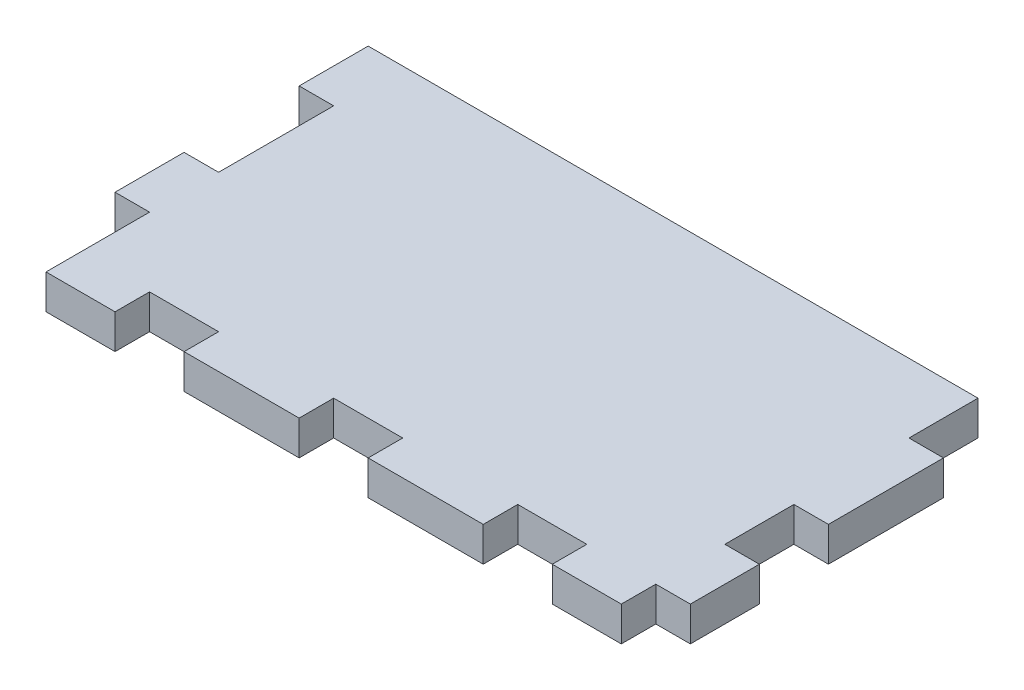
ISO-10303-21;
HEADER;
FILE_DESCRIPTION(('STEP AP214'),'2;1');
FILE_NAME('part.step','',(''),(''),'','','');
FILE_SCHEMA(('AUTOMOTIVE_DESIGN { 1 0 10303 214 1 1 1 1 }'));
ENDSEC;
DATA;
#1=APPLICATION_CONTEXT('core data for automotive mechanical design processes');
#2=APPLICATION_PROTOCOL_DEFINITION('international standard','automotive_design',2000,#1);
#3=PRODUCT_CONTEXT('',#1,'mechanical');
#4=PRODUCT('Part','Part','',(#3));
#5=PRODUCT_RELATED_PRODUCT_CATEGORY('part','',(#4));
#6=PRODUCT_DEFINITION_FORMATION('','',#4);
#7=PRODUCT_DEFINITION_CONTEXT('part definition',#1,'design');
#8=PRODUCT_DEFINITION('design','',#6,#7);
#9=PRODUCT_DEFINITION_SHAPE('','',#8);
#10=(LENGTH_UNIT() NAMED_UNIT(*) SI_UNIT(.MILLI.,.METRE.));
#11=(NAMED_UNIT(*) PLANE_ANGLE_UNIT() SI_UNIT($,.RADIAN.));
#12=(NAMED_UNIT(*) SI_UNIT($,.STERADIAN.) SOLID_ANGLE_UNIT());
#13=UNCERTAINTY_MEASURE_WITH_UNIT(LENGTH_MEASURE(1.E-05),#10,'distance_accuracy_value','');
#14=(GEOMETRIC_REPRESENTATION_CONTEXT(3) GLOBAL_UNCERTAINTY_ASSIGNED_CONTEXT((#13)) GLOBAL_UNIT_ASSIGNED_CONTEXT((#10,
#11,#12)) REPRESENTATION_CONTEXT('',''));
#15=CARTESIAN_POINT('',(0.,0.,0.));
#16=DIRECTION('',(0.,0.,1.));
#17=DIRECTION('',(1.,0.,0.));
#18=AXIS2_PLACEMENT_3D('',#15,#16,#17);
#19=CARTESIAN_POINT('',(-53.,3.,0.));
#20=DIRECTION('',(1.,0.,0.));
#21=DIRECTION('',(0.,0.,-1.));
#22=AXIS2_PLACEMENT_3D('',#19,#20,#21);
#23=PLANE('',#22);
#24=DIRECTION('',(0.,0.,1.));
#25=VECTOR('',#24,1.);
#26=CARTESIAN_POINT('',(-53.,0.,0.));
#27=LINE('',#26,#25);
#28=CARTESIAN_POINT('',(-53.,0.,-12.));
#29=VERTEX_POINT('',#28);
#30=CARTESIAN_POINT('',(-53.,0.,-5.99999999999999));
#31=VERTEX_POINT('',#30);
#32=EDGE_CURVE('E891',#29,#31,#27,.T.);
#33=ORIENTED_EDGE('',*,*,#32,.T.);
#34=DIRECTION('',(0.,-1.,0.));
#35=VECTOR('',#34,1.);
#36=CARTESIAN_POINT('',(-53.,3.,-5.99999999999999));
#37=LINE('',#36,#35);
#38=CARTESIAN_POINT('',(-53.,3.,-5.99999999999999));
#39=VERTEX_POINT('',#38);
#40=EDGE_CURVE('E995',#39,#31,#37,.T.);
#41=ORIENTED_EDGE('',*,*,#40,.F.);
#42=DIRECTION('',(0.,0.,1.));
#43=VECTOR('',#42,1.);
#44=CARTESIAN_POINT('',(-53.,3.,0.));
#45=LINE('',#44,#43);
#46=CARTESIAN_POINT('',(-53.,3.,-12.));
#47=VERTEX_POINT('',#46);
#48=EDGE_CURVE('E1383',#47,#39,#45,.T.);
#49=ORIENTED_EDGE('',*,*,#48,.F.);
#50=DIRECTION('',(0.,-1.,0.));
#51=VECTOR('',#50,1.);
#52=CARTESIAN_POINT('',(-53.,3.,-12.));
#53=LINE('',#52,#51);
#54=EDGE_CURVE('E997',#47,#29,#53,.T.);
#55=ORIENTED_EDGE('',*,*,#54,.T.);
#56=EDGE_LOOP('',(#33,#41,#49,#55));
#57=FACE_BOUND('',#56,.T.);
#58=ADVANCED_FACE('F611',(#57),#23,.F.);
#59=CARTESIAN_POINT('',(0.,3.,-6.00000000000001));
#60=DIRECTION('',(0.,0.,1.));
#61=DIRECTION('',(1.,0.,0.));
#62=AXIS2_PLACEMENT_3D('',#59,#60,#61);
#63=PLANE('',#62);
#64=DIRECTION('',(-1.,0.,0.));
#65=VECTOR('',#64,1.);
#66=CARTESIAN_POINT('',(0.,0.,-6.00000000000001));
#67=LINE('',#66,#65);
#68=CARTESIAN_POINT('',(-50.,0.,-5.99999999999999));
#69=VERTEX_POINT('',#68);
#70=EDGE_CURVE('E895',#69,#31,#67,.T.);
#71=ORIENTED_EDGE('',*,*,#70,.F.);
#72=DIRECTION('',(0.,-1.,0.));
#73=VECTOR('',#72,1.);
#74=CARTESIAN_POINT('',(-50.,3.,-5.99999999999999));
#75=LINE('',#74,#73);
#76=CARTESIAN_POINT('',(-50.,3.,-5.99999999999999));
#77=VERTEX_POINT('',#76);
#78=EDGE_CURVE('E993',#77,#69,#75,.T.);
#79=ORIENTED_EDGE('',*,*,#78,.F.);
#80=DIRECTION('',(-1.,0.,0.));
#81=VECTOR('',#80,1.);
#82=CARTESIAN_POINT('',(0.,3.,-6.00000000000001));
#83=LINE('',#82,#81);
#84=EDGE_CURVE('E1391',#77,#39,#83,.T.);
#85=ORIENTED_EDGE('',*,*,#84,.T.);
#86=ORIENTED_EDGE('',*,*,#40,.T.);
#87=EDGE_LOOP('',(#71,#79,#85,#86));
#88=FACE_BOUND('',#87,.T.);
#89=ADVANCED_FACE('F1048',(#88),#63,.T.);
#90=CARTESIAN_POINT('',(-50.,3.,0.));
#91=DIRECTION('',(-1.,0.,0.));
#92=DIRECTION('',(0.,0.,1.));
#93=AXIS2_PLACEMENT_3D('',#90,#91,#92);
#94=PLANE('',#93);
#95=DIRECTION('',(0.,0.,-1.));
#96=VECTOR('',#95,1.);
#97=CARTESIAN_POINT('',(-50.,0.,0.));
#98=LINE('',#97,#96);
#99=CARTESIAN_POINT('',(-50.,0.,3.00000000000001));
#100=VERTEX_POINT('',#99);
#101=EDGE_CURVE('E898',#100,#69,#98,.T.);
#102=ORIENTED_EDGE('',*,*,#101,.F.);
#103=DIRECTION('',(0.,-1.,0.));
#104=VECTOR('',#103,1.);
#105=CARTESIAN_POINT('',(-50.,3.,3.00000000000001));
#106=LINE('',#105,#104);
#107=CARTESIAN_POINT('',(-50.,3.,3.00000000000001));
#108=VERTEX_POINT('',#107);
#109=EDGE_CURVE('E1008',#108,#100,#106,.T.);
#110=ORIENTED_EDGE('',*,*,#109,.F.);
#111=DIRECTION('',(0.,0.,-1.));
#112=VECTOR('',#111,1.);
#113=CARTESIAN_POINT('',(-50.,3.,0.));
#114=LINE('',#113,#112);
#115=EDGE_CURVE('E843',#108,#77,#114,.T.);
#116=ORIENTED_EDGE('',*,*,#115,.T.);
#117=ORIENTED_EDGE('',*,*,#78,.T.);
#118=EDGE_LOOP('',(#102,#110,#116,#117));
#119=FACE_BOUND('',#118,.T.);
#120=ADVANCED_FACE('F1054',(#119),#94,.T.);
#121=CARTESIAN_POINT('',(0.,3.,0.));
#122=DIRECTION('',(0.,0.,1.));
#123=DIRECTION('',(1.,0.,0.));
#124=AXIS2_PLACEMENT_3D('',#121,#122,#123);
#125=PLANE('',#124);
#126=DIRECTION('',(0.,-1.,0.));
#127=VECTOR('',#126,1.);
#128=CARTESIAN_POINT('',(-38.,3.,0.));
#129=LINE('',#128,#127);
#130=CARTESIAN_POINT('',(-38.,3.,0.));
#131=VERTEX_POINT('',#130);
#132=CARTESIAN_POINT('',(-38.,0.,0.));
#133=VERTEX_POINT('',#132);
#134=EDGE_CURVE('E12',#131,#133,#129,.T.);
#135=ORIENTED_EDGE('',*,*,#134,.F.);
#136=DIRECTION('',(-1.,0.,0.));
#137=VECTOR('',#136,1.);
#138=CARTESIAN_POINT('',(0.,3.,0.));
#139=LINE('',#138,#137);
#140=CARTESIAN_POINT('',(-44.,3.,0.));
#141=VERTEX_POINT('',#140);
#142=EDGE_CURVE('E837',#131,#141,#139,.T.);
#143=ORIENTED_EDGE('',*,*,#142,.T.);
#144=DIRECTION('',(0.,1.,0.));
#145=VECTOR('',#144,1.);
#146=CARTESIAN_POINT('',(-44.,3.,0.));
#147=LINE('',#146,#145);
#148=CARTESIAN_POINT('',(-44.,0.,0.));
#149=VERTEX_POINT('',#148);
#150=EDGE_CURVE('E630',#149,#141,#147,.T.);
#151=ORIENTED_EDGE('',*,*,#150,.F.);
#152=DIRECTION('',(-1.,0.,0.));
#153=VECTOR('',#152,1.);
#154=CARTESIAN_POINT('',(0.,0.,0.));
#155=LINE('',#154,#153);
#156=EDGE_CURVE('E901',#133,#149,#155,.T.);
#157=ORIENTED_EDGE('',*,*,#156,.F.);
#158=EDGE_LOOP('',(#135,#143,#151,#157));
#159=FACE_BOUND('',#158,.T.);
#160=ADVANCED_FACE('F1282',(#159),#125,.T.);
#161=CARTESIAN_POINT('',(-22.,3.,0.));
#162=VERTEX_POINT('',#161);
#163=CARTESIAN_POINT('',(-28.,3.,0.));
#164=VERTEX_POINT('',#163);
#165=EDGE_CURVE('E827',#162,#164,#139,.T.);
#166=ORIENTED_EDGE('',*,*,#165,.T.);
#167=DIRECTION('',(0.,-1.,0.));
#168=VECTOR('',#167,1.);
#169=CARTESIAN_POINT('',(-28.,3.,0.));
#170=LINE('',#169,#168);
#171=CARTESIAN_POINT('',(-28.,0.,0.));
#172=VERTEX_POINT('',#171);
#173=EDGE_CURVE('E621',#164,#172,#170,.T.);
#174=ORIENTED_EDGE('',*,*,#173,.T.);
#175=CARTESIAN_POINT('',(-22.,0.,0.));
#176=VERTEX_POINT('',#175);
#177=EDGE_CURVE('E903',#176,#172,#155,.T.);
#178=ORIENTED_EDGE('',*,*,#177,.F.);
#179=DIRECTION('',(0.,-1.,0.));
#180=VECTOR('',#179,1.);
#181=CARTESIAN_POINT('',(-22.,3.,0.));
#182=LINE('',#181,#180);
#183=EDGE_CURVE('E834',#162,#176,#182,.T.);
#184=ORIENTED_EDGE('',*,*,#183,.F.);
#185=EDGE_LOOP('',(#166,#174,#178,#184));
#186=FACE_BOUND('',#185,.T.);
#187=ADVANCED_FACE('F833',(#186),#125,.T.);
#188=CARTESIAN_POINT('',(-22.,3.,0.));
#189=DIRECTION('',(1.,0.,0.));
#190=DIRECTION('',(0.,0.,-1.));
#191=AXIS2_PLACEMENT_3D('',#188,#189,#190);
#192=PLANE('',#191);
#193=DIRECTION('',(0.,0.,1.));
#194=VECTOR('',#193,1.);
#195=CARTESIAN_POINT('',(-22.,0.,0.));
#196=LINE('',#195,#194);
#197=CARTESIAN_POINT('',(-22.,0.,3.));
#198=VERTEX_POINT('',#197);
#199=EDGE_CURVE('E905',#176,#198,#196,.T.);
#200=ORIENTED_EDGE('',*,*,#199,.T.);
#201=DIRECTION('',(0.,-1.,0.));
#202=VECTOR('',#201,1.);
#203=CARTESIAN_POINT('',(-22.,3.,3.));
#204=LINE('',#203,#202);
#205=CARTESIAN_POINT('',(-22.,3.,3.));
#206=VERTEX_POINT('',#205);
#207=EDGE_CURVE('E989',#206,#198,#204,.T.);
#208=ORIENTED_EDGE('',*,*,#207,.F.);
#209=DIRECTION('',(0.,0.,1.));
#210=VECTOR('',#209,1.);
#211=CARTESIAN_POINT('',(-22.,3.,0.));
#212=LINE('',#211,#210);
#213=EDGE_CURVE('E836',#162,#206,#212,.T.);
#214=ORIENTED_EDGE('',*,*,#213,.F.);
#215=ORIENTED_EDGE('',*,*,#183,.T.);
#216=EDGE_LOOP('',(#200,#208,#214,#215));
#217=FACE_BOUND('',#216,.T.);
#218=ADVANCED_FACE('F1301',(#217),#192,.F.);
#219=CARTESIAN_POINT('',(0.,3.,3.));
#220=DIRECTION('',(0.,0.,-1.));
#221=DIRECTION('',(-1.,0.,0.));
#222=AXIS2_PLACEMENT_3D('',#219,#220,#221);
#223=PLANE('',#222);
#224=DIRECTION('',(1.,0.,0.));
#225=VECTOR('',#224,1.);
#226=CARTESIAN_POINT('',(0.,0.,3.));
#227=LINE('',#226,#225);
#228=CARTESIAN_POINT('',(-12.,0.,3.));
#229=VERTEX_POINT('',#228);
#230=EDGE_CURVE('E908',#198,#229,#227,.T.);
#231=ORIENTED_EDGE('',*,*,#230,.T.);
#232=DIRECTION('',(0.,-1.,0.));
#233=VECTOR('',#232,1.);
#234=CARTESIAN_POINT('',(-12.,3.,3.));
#235=LINE('',#234,#233);
#236=CARTESIAN_POINT('',(-12.,3.,3.));
#237=VERTEX_POINT('',#236);
#238=EDGE_CURVE('E987',#237,#229,#235,.T.);
#239=ORIENTED_EDGE('',*,*,#238,.F.);
#240=DIRECTION('',(1.,0.,0.));
#241=VECTOR('',#240,1.);
#242=CARTESIAN_POINT('',(0.,3.,3.));
#243=LINE('',#242,#241);
#244=EDGE_CURVE('E840',#206,#237,#243,.T.);
#245=ORIENTED_EDGE('',*,*,#244,.F.);
#246=ORIENTED_EDGE('',*,*,#207,.T.);
#247=EDGE_LOOP('',(#231,#239,#245,#246));
#248=FACE_BOUND('',#247,.T.);
#249=ADVANCED_FACE('F1291',(#248),#223,.F.);
#250=CARTESIAN_POINT('',(-12.,3.,0.));
#251=DIRECTION('',(1.,0.,0.));
#252=DIRECTION('',(0.,0.,-1.));
#253=AXIS2_PLACEMENT_3D('',#250,#251,#252);
#254=PLANE('',#253);
#255=DIRECTION('',(0.,0.,1.));
#256=VECTOR('',#255,1.);
#257=CARTESIAN_POINT('',(-12.,0.,0.));
#258=LINE('',#257,#256);
#259=CARTESIAN_POINT('',(-12.,0.,0.));
#260=VERTEX_POINT('',#259);
#261=EDGE_CURVE('E911',#260,#229,#258,.T.);
#262=ORIENTED_EDGE('',*,*,#261,.F.);
#263=DIRECTION('',(0.,-1.,0.));
#264=VECTOR('',#263,1.);
#265=CARTESIAN_POINT('',(-12.,3.,0.));
#266=LINE('',#265,#264);
#267=CARTESIAN_POINT('',(-12.,3.,0.));
#268=VERTEX_POINT('',#267);
#269=EDGE_CURVE('E985',#268,#260,#266,.T.);
#270=ORIENTED_EDGE('',*,*,#269,.F.);
#271=DIRECTION('',(0.,0.,1.));
#272=VECTOR('',#271,1.);
#273=CARTESIAN_POINT('',(-12.,3.,0.));
#274=LINE('',#273,#272);
#275=EDGE_CURVE('E847',#268,#237,#274,.T.);
#276=ORIENTED_EDGE('',*,*,#275,.T.);
#277=ORIENTED_EDGE('',*,*,#238,.T.);
#278=EDGE_LOOP('',(#262,#270,#276,#277));
#279=FACE_BOUND('',#278,.T.);
#280=ADVANCED_FACE('F1280',(#279),#254,.T.);
#281=CARTESIAN_POINT('',(-6.,0.,0.));
#282=VERTEX_POINT('',#281);
#283=EDGE_CURVE('E906',#282,#260,#155,.T.);
#284=ORIENTED_EDGE('',*,*,#283,.F.);
#285=DIRECTION('',(0.,-1.,0.));
#286=VECTOR('',#285,1.);
#287=CARTESIAN_POINT('',(-6.,3.,0.));
#288=LINE('',#287,#286);
#289=CARTESIAN_POINT('',(-6.,3.,0.));
#290=VERTEX_POINT('',#289);
#291=EDGE_CURVE('E983',#290,#282,#288,.T.);
#292=ORIENTED_EDGE('',*,*,#291,.F.);
#293=EDGE_CURVE('E839',#290,#268,#139,.T.);
#294=ORIENTED_EDGE('',*,*,#293,.T.);
#295=ORIENTED_EDGE('',*,*,#269,.T.);
#296=EDGE_LOOP('',(#284,#292,#294,#295));
#297=FACE_BOUND('',#296,.T.);
#298=ADVANCED_FACE('F1270',(#297),#125,.T.);
#299=CARTESIAN_POINT('',(-6.,3.,0.));
#300=DIRECTION('',(1.,0.,0.));
#301=DIRECTION('',(0.,0.,-1.));
#302=AXIS2_PLACEMENT_3D('',#299,#300,#301);
#303=PLANE('',#302);
#304=DIRECTION('',(0.,0.,1.));
#305=VECTOR('',#304,1.);
#306=CARTESIAN_POINT('',(-6.,0.,0.));
#307=LINE('',#306,#305);
#308=CARTESIAN_POINT('',(-6.,0.,3.));
#309=VERTEX_POINT('',#308);
#310=EDGE_CURVE('E914',#282,#309,#307,.T.);
#311=ORIENTED_EDGE('',*,*,#310,.T.);
#312=DIRECTION('',(0.,-1.,0.));
#313=VECTOR('',#312,1.);
#314=CARTESIAN_POINT('',(-6.,3.,3.));
#315=LINE('',#314,#313);
#316=CARTESIAN_POINT('',(-6.,3.,3.));
#317=VERTEX_POINT('',#316);
#318=EDGE_CURVE('E981',#317,#309,#315,.T.);
#319=ORIENTED_EDGE('',*,*,#318,.F.);
#320=DIRECTION('',(0.,0.,1.));
#321=VECTOR('',#320,1.);
#322=CARTESIAN_POINT('',(-6.,3.,0.));
#323=LINE('',#322,#321);
#324=EDGE_CURVE('E846',#290,#317,#323,.T.);
#325=ORIENTED_EDGE('',*,*,#324,.F.);
#326=ORIENTED_EDGE('',*,*,#291,.T.);
#327=EDGE_LOOP('',(#311,#319,#325,#326));
#328=FACE_BOUND('',#327,.T.);
#329=ADVANCED_FACE('F1260',(#328),#303,.F.);
#330=CARTESIAN_POINT('',(0.,3.,3.00000000000001));
#331=DIRECTION('',(0.,0.,1.));
#332=DIRECTION('',(1.,0.,0.));
#333=AXIS2_PLACEMENT_3D('',#330,#331,#332);
#334=PLANE('',#333);
#335=DIRECTION('',(-1.,0.,0.));
#336=VECTOR('',#335,1.);
#337=CARTESIAN_POINT('',(0.,0.,3.00000000000001));
#338=LINE('',#337,#336);
#339=CARTESIAN_POINT('',(0.,0.,3.00000000000001));
#340=VERTEX_POINT('',#339);
#341=EDGE_CURVE('E917',#340,#309,#338,.T.);
#342=ORIENTED_EDGE('',*,*,#341,.F.);
#343=DIRECTION('',(0.,-1.,0.));
#344=VECTOR('',#343,1.);
#345=CARTESIAN_POINT('',(0.,3.,3.00000000000001));
#346=LINE('',#345,#344);
#347=CARTESIAN_POINT('',(0.,3.,3.00000000000001));
#348=VERTEX_POINT('',#347);
#349=EDGE_CURVE('E979',#348,#340,#346,.T.);
#350=ORIENTED_EDGE('',*,*,#349,.F.);
#351=DIRECTION('',(-1.,0.,0.));
#352=VECTOR('',#351,1.);
#353=CARTESIAN_POINT('',(0.,3.,3.00000000000001));
#354=LINE('',#353,#352);
#355=EDGE_CURVE('E850',#348,#317,#354,.T.);
#356=ORIENTED_EDGE('',*,*,#355,.T.);
#357=ORIENTED_EDGE('',*,*,#318,.T.);
#358=EDGE_LOOP('',(#342,#350,#356,#357));
#359=FACE_BOUND('',#358,.T.);
#360=ADVANCED_FACE('F1250',(#359),#334,.T.);
#361=CARTESIAN_POINT('',(0.,3.,0.));
#362=DIRECTION('',(1.,0.,0.));
#363=DIRECTION('',(0.,0.,-1.));
#364=AXIS2_PLACEMENT_3D('',#361,#362,#363);
#365=PLANE('',#364);
#366=DIRECTION('',(0.,0.,1.));
#367=VECTOR('',#366,1.);
#368=CARTESIAN_POINT('',(0.,0.,0.));
#369=LINE('',#368,#367);
#370=CARTESIAN_POINT('',(0.,0.,0.));
#371=VERTEX_POINT('',#370);
#372=EDGE_CURVE('E920',#371,#340,#369,.T.);
#373=ORIENTED_EDGE('',*,*,#372,.F.);
#374=DIRECTION('',(0.,-1.,0.));
#375=VECTOR('',#374,1.);
#376=CARTESIAN_POINT('',(0.,3.,0.));
#377=LINE('',#376,#375);
#378=CARTESIAN_POINT('',(0.,3.,0.));
#379=VERTEX_POINT('',#378);
#380=EDGE_CURVE('E977',#379,#371,#377,.T.);
#381=ORIENTED_EDGE('',*,*,#380,.F.);
#382=DIRECTION('',(0.,0.,1.));
#383=VECTOR('',#382,1.);
#384=CARTESIAN_POINT('',(0.,3.,0.));
#385=LINE('',#384,#383);
#386=EDGE_CURVE('E860',#379,#348,#385,.T.);
#387=ORIENTED_EDGE('',*,*,#386,.T.);
#388=ORIENTED_EDGE('',*,*,#349,.T.);
#389=EDGE_LOOP('',(#373,#381,#387,#388));
#390=FACE_BOUND('',#389,.T.);
#391=ADVANCED_FACE('F1240',(#390),#365,.T.);
#392=CARTESIAN_POINT('',(0.,3.,0.));
#393=DIRECTION('',(0.,0.,-1.));
#394=DIRECTION('',(-1.,0.,0.));
#395=AXIS2_PLACEMENT_3D('',#392,#393,#394);
#396=PLANE('',#395);
#397=DIRECTION('',(1.,0.,0.));
#398=VECTOR('',#397,1.);
#399=CARTESIAN_POINT('',(0.,0.,0.));
#400=LINE('',#399,#398);
#401=CARTESIAN_POINT('',(3.,0.,0.));
#402=VERTEX_POINT('',#401);
#403=EDGE_CURVE('E923',#371,#402,#400,.T.);
#404=ORIENTED_EDGE('',*,*,#403,.T.);
#405=DIRECTION('',(0.,-1.,0.));
#406=VECTOR('',#405,1.);
#407=CARTESIAN_POINT('',(3.,3.,0.));
#408=LINE('',#407,#406);
#409=CARTESIAN_POINT('',(3.,3.,0.));
#410=VERTEX_POINT('',#409);
#411=EDGE_CURVE('E974',#410,#402,#408,.T.);
#412=ORIENTED_EDGE('',*,*,#411,.F.);
#413=DIRECTION('',(1.,0.,0.));
#414=VECTOR('',#413,1.);
#415=CARTESIAN_POINT('',(0.,3.,0.));
#416=LINE('',#415,#414);
#417=EDGE_CURVE('E863',#379,#410,#416,.T.);
#418=ORIENTED_EDGE('',*,*,#417,.F.);
#419=ORIENTED_EDGE('',*,*,#380,.T.);
#420=EDGE_LOOP('',(#404,#412,#418,#419));
#421=FACE_BOUND('',#420,.T.);
#422=ADVANCED_FACE('F1230',(#421),#396,.F.);
#423=CARTESIAN_POINT('',(3.,3.,0.));
#424=DIRECTION('',(-1.,0.,0.));
#425=DIRECTION('',(0.,0.,1.));
#426=AXIS2_PLACEMENT_3D('',#423,#424,#425);
#427=PLANE('',#426);
#428=DIRECTION('',(0.,0.,-1.));
#429=VECTOR('',#428,1.);
#430=CARTESIAN_POINT('',(3.,0.,0.));
#431=LINE('',#430,#429);
#432=CARTESIAN_POINT('',(3.,0.,-5.99999999999999));
#433=VERTEX_POINT('',#432);
#434=EDGE_CURVE('E925',#402,#433,#431,.T.);
#435=ORIENTED_EDGE('',*,*,#434,.T.);
#436=DIRECTION('',(0.,-1.,0.));
#437=VECTOR('',#436,1.);
#438=CARTESIAN_POINT('',(3.,3.,-5.99999999999999));
#439=LINE('',#438,#437);
#440=CARTESIAN_POINT('',(3.,3.,-5.99999999999999));
#441=VERTEX_POINT('',#440);
#442=EDGE_CURVE('E972',#441,#433,#439,.T.);
#443=ORIENTED_EDGE('',*,*,#442,.F.);
#444=DIRECTION('',(0.,0.,-1.));
#445=VECTOR('',#444,1.);
#446=CARTESIAN_POINT('',(3.,3.,0.));
#447=LINE('',#446,#445);
#448=EDGE_CURVE('E865',#410,#441,#447,.T.);
#449=ORIENTED_EDGE('',*,*,#448,.F.);
#450=ORIENTED_EDGE('',*,*,#411,.T.);
#451=EDGE_LOOP('',(#435,#443,#449,#450));
#452=FACE_BOUND('',#451,.T.);
#453=ADVANCED_FACE('F1219',(#452),#427,.F.);
#454=CARTESIAN_POINT('',(0.,3.,-5.99999999999999));
#455=DIRECTION('',(0.,0.,-1.));
#456=DIRECTION('',(-1.,0.,0.));
#457=AXIS2_PLACEMENT_3D('',#454,#455,#456);
#458=PLANE('',#457);
#459=DIRECTION('',(1.,0.,0.));
#460=VECTOR('',#459,1.);
#461=CARTESIAN_POINT('',(0.,0.,-5.99999999999999));
#462=LINE('',#461,#460);
#463=CARTESIAN_POINT('',(0.,0.,-5.99999999999999));
#464=VERTEX_POINT('',#463);
#465=EDGE_CURVE('E928',#464,#433,#462,.T.);
#466=ORIENTED_EDGE('',*,*,#465,.F.);
#467=DIRECTION('',(0.,-1.,0.));
#468=VECTOR('',#467,1.);
#469=CARTESIAN_POINT('',(0.,3.,-5.99999999999999));
#470=LINE('',#469,#468);
#471=CARTESIAN_POINT('',(0.,3.,-5.99999999999999));
#472=VERTEX_POINT('',#471);
#473=EDGE_CURVE('E970',#472,#464,#470,.T.);
#474=ORIENTED_EDGE('',*,*,#473,.F.);
#475=DIRECTION('',(1.,0.,0.));
#476=VECTOR('',#475,1.);
#477=CARTESIAN_POINT('',(0.,3.,-5.99999999999999));
#478=LINE('',#477,#476);
#479=EDGE_CURVE('E867',#472,#441,#478,.T.);
#480=ORIENTED_EDGE('',*,*,#479,.T.);
#481=ORIENTED_EDGE('',*,*,#442,.T.);
#482=EDGE_LOOP('',(#466,#474,#480,#481));
#483=FACE_BOUND('',#482,.T.);
#484=ADVANCED_FACE('F1209',(#483),#458,.T.);
#485=CARTESIAN_POINT('',(0.,3.,0.));
#486=DIRECTION('',(-1.,0.,0.));
#487=DIRECTION('',(0.,0.,1.));
#488=AXIS2_PLACEMENT_3D('',#485,#486,#487);
#489=PLANE('',#488);
#490=DIRECTION('',(0.,0.,-1.));
#491=VECTOR('',#490,1.);
#492=CARTESIAN_POINT('',(0.,0.,0.));
#493=LINE('',#492,#491);
#494=CARTESIAN_POINT('',(0.,0.,-12.));
#495=VERTEX_POINT('',#494);
#496=EDGE_CURVE('E931',#464,#495,#493,.T.);
#497=ORIENTED_EDGE('',*,*,#496,.T.);
#498=DIRECTION('',(0.,-1.,0.));
#499=VECTOR('',#498,1.);
#500=CARTESIAN_POINT('',(0.,3.,-12.));
#501=LINE('',#500,#499);
#502=CARTESIAN_POINT('',(0.,3.,-12.));
#503=VERTEX_POINT('',#502);
#504=EDGE_CURVE('E967',#503,#495,#501,.T.);
#505=ORIENTED_EDGE('',*,*,#504,.F.);
#506=DIRECTION('',(0.,0.,-1.));
#507=VECTOR('',#506,1.);
#508=CARTESIAN_POINT('',(0.,3.,0.));
#509=LINE('',#508,#507);
#510=EDGE_CURVE('E870',#472,#503,#509,.T.);
#511=ORIENTED_EDGE('',*,*,#510,.F.);
#512=ORIENTED_EDGE('',*,*,#473,.T.);
#513=EDGE_LOOP('',(#497,#505,#511,#512));
#514=FACE_BOUND('',#513,.T.);
#515=ADVANCED_FACE('F1088',(#514),#489,.F.);
#516=CARTESIAN_POINT('',(0.,3.,-12.));
#517=DIRECTION('',(0.,0.,-1.));
#518=DIRECTION('',(-1.,0.,0.));
#519=AXIS2_PLACEMENT_3D('',#516,#517,#518);
#520=PLANE('',#519);
#521=DIRECTION('',(1.,0.,0.));
#522=VECTOR('',#521,1.);
#523=CARTESIAN_POINT('',(0.,0.,-12.));
#524=LINE('',#523,#522);
#525=CARTESIAN_POINT('',(3.,0.,-12.));
#526=VERTEX_POINT('',#525);
#527=EDGE_CURVE('E933',#495,#526,#524,.T.);
#528=ORIENTED_EDGE('',*,*,#527,.T.);
#529=DIRECTION('',(0.,-1.,0.));
#530=VECTOR('',#529,1.);
#531=CARTESIAN_POINT('',(3.,3.,-12.));
#532=LINE('',#531,#530);
#533=CARTESIAN_POINT('',(3.,3.,-12.));
#534=VERTEX_POINT('',#533);
#535=EDGE_CURVE('E964',#534,#526,#532,.T.);
#536=ORIENTED_EDGE('',*,*,#535,.F.);
#537=DIRECTION('',(1.,0.,0.));
#538=VECTOR('',#537,1.);
#539=CARTESIAN_POINT('',(0.,3.,-12.));
#540=LINE('',#539,#538);
#541=EDGE_CURVE('E872',#503,#534,#540,.T.);
#542=ORIENTED_EDGE('',*,*,#541,.F.);
#543=ORIENTED_EDGE('',*,*,#504,.T.);
#544=EDGE_LOOP('',(#528,#536,#542,#543));
#545=FACE_BOUND('',#544,.T.);
#546=ADVANCED_FACE('F1190',(#545),#520,.F.);
#547=CARTESIAN_POINT('',(3.,3.,0.));
#548=DIRECTION('',(-1.,0.,0.));
#549=DIRECTION('',(0.,0.,1.));
#550=AXIS2_PLACEMENT_3D('',#547,#548,#549);
#551=PLANE('',#550);
#552=DIRECTION('',(0.,0.,-1.));
#553=VECTOR('',#552,1.);
#554=CARTESIAN_POINT('',(3.,0.,0.));
#555=LINE('',#554,#553);
#556=CARTESIAN_POINT('',(3.,0.,-22.));
#557=VERTEX_POINT('',#556);
#558=EDGE_CURVE('E936',#526,#557,#555,.T.);
#559=ORIENTED_EDGE('',*,*,#558,.T.);
#560=DIRECTION('',(0.,-1.,0.));
#561=VECTOR('',#560,1.);
#562=CARTESIAN_POINT('',(3.,3.,-22.));
#563=LINE('',#562,#561);
#564=CARTESIAN_POINT('',(3.,3.,-22.));
#565=VERTEX_POINT('',#564);
#566=EDGE_CURVE('E962',#565,#557,#563,.T.);
#567=ORIENTED_EDGE('',*,*,#566,.F.);
#568=DIRECTION('',(0.,0.,-1.));
#569=VECTOR('',#568,1.);
#570=CARTESIAN_POINT('',(3.,3.,0.));
#571=LINE('',#570,#569);
#572=EDGE_CURVE('E875',#534,#565,#571,.T.);
#573=ORIENTED_EDGE('',*,*,#572,.F.);
#574=ORIENTED_EDGE('',*,*,#535,.T.);
#575=EDGE_LOOP('',(#559,#567,#573,#574));
#576=FACE_BOUND('',#575,.T.);
#577=ADVANCED_FACE('F1179',(#576),#551,.F.);
#578=CARTESIAN_POINT('',(0.,3.,-22.));
#579=DIRECTION('',(0.,0.,-1.));
#580=DIRECTION('',(-1.,0.,0.));
#581=AXIS2_PLACEMENT_3D('',#578,#579,#580);
#582=PLANE('',#581);
#583=DIRECTION('',(1.,0.,0.));
#584=VECTOR('',#583,1.);
#585=CARTESIAN_POINT('',(0.,0.,-22.));
#586=LINE('',#585,#584);
#587=CARTESIAN_POINT('',(0.,0.,-22.));
#588=VERTEX_POINT('',#587);
#589=EDGE_CURVE('E939',#588,#557,#586,.T.);
#590=ORIENTED_EDGE('',*,*,#589,.F.);
#591=DIRECTION('',(0.,-1.,0.));
#592=VECTOR('',#591,1.);
#593=CARTESIAN_POINT('',(0.,3.,-22.));
#594=LINE('',#593,#592);
#595=CARTESIAN_POINT('',(0.,3.,-22.));
#596=VERTEX_POINT('',#595);
#597=EDGE_CURVE('E960',#596,#588,#594,.T.);
#598=ORIENTED_EDGE('',*,*,#597,.F.);
#599=DIRECTION('',(1.,0.,0.));
#600=VECTOR('',#599,1.);
#601=CARTESIAN_POINT('',(0.,3.,-22.));
#602=LINE('',#601,#600);
#603=EDGE_CURVE('E877',#596,#565,#602,.T.);
#604=ORIENTED_EDGE('',*,*,#603,.T.);
#605=ORIENTED_EDGE('',*,*,#566,.T.);
#606=EDGE_LOOP('',(#590,#598,#604,#605));
#607=FACE_BOUND('',#606,.T.);
#608=ADVANCED_FACE('F1085',(#607),#582,.T.);
#609=CARTESIAN_POINT('',(0.,0.,-28.));
#610=VERTEX_POINT('',#609);
#611=EDGE_CURVE('E934',#588,#610,#493,.T.);
#612=ORIENTED_EDGE('',*,*,#611,.T.);
#613=DIRECTION('',(0.,-1.,0.));
#614=VECTOR('',#613,1.);
#615=CARTESIAN_POINT('',(0.,3.,-28.));
#616=LINE('',#615,#614);
#617=CARTESIAN_POINT('',(0.,3.,-28.));
#618=VERTEX_POINT('',#617);
#619=EDGE_CURVE('E958',#618,#610,#616,.T.);
#620=ORIENTED_EDGE('',*,*,#619,.F.);
#621=EDGE_CURVE('E873',#596,#618,#509,.T.);
#622=ORIENTED_EDGE('',*,*,#621,.F.);
#623=ORIENTED_EDGE('',*,*,#597,.T.);
#624=EDGE_LOOP('',(#612,#620,#622,#623));
#625=FACE_BOUND('',#624,.T.);
#626=ADVANCED_FACE('F1079',(#625),#489,.F.);
#627=CARTESIAN_POINT('',(0.,3.,-28.));
#628=DIRECTION('',(0.,0.,1.));
#629=DIRECTION('',(1.,0.,0.));
#630=AXIS2_PLACEMENT_3D('',#627,#628,#629);
#631=PLANE('',#630);
#632=DIRECTION('',(-1.,0.,0.));
#633=VECTOR('',#632,1.);
#634=CARTESIAN_POINT('',(0.,0.,-28.));
#635=LINE('',#634,#633);
#636=CARTESIAN_POINT('',(-53.,0.,-28.));
#637=VERTEX_POINT('',#636);
#638=EDGE_CURVE('E668',#610,#637,#635,.T.);
#639=ORIENTED_EDGE('',*,*,#638,.T.);
#640=DIRECTION('',(0.,-1.,0.));
#641=VECTOR('',#640,1.);
#642=CARTESIAN_POINT('',(-53.,3.,-28.));
#643=LINE('',#642,#641);
#644=CARTESIAN_POINT('',(-53.,3.,-28.));
#645=VERTEX_POINT('',#644);
#646=EDGE_CURVE('E955',#645,#637,#643,.T.);
#647=ORIENTED_EDGE('',*,*,#646,.F.);
#648=DIRECTION('',(-1.,0.,0.));
#649=VECTOR('',#648,1.);
#650=CARTESIAN_POINT('',(0.,3.,-28.));
#651=LINE('',#650,#649);
#652=EDGE_CURVE('E880',#618,#645,#651,.T.);
#653=ORIENTED_EDGE('',*,*,#652,.F.);
#654=ORIENTED_EDGE('',*,*,#619,.T.);
#655=EDGE_LOOP('',(#639,#647,#653,#654));
#656=FACE_BOUND('',#655,.T.);
#657=ADVANCED_FACE('F1084',(#656),#631,.F.);
#658=CARTESIAN_POINT('',(-53.,3.,0.));
#659=DIRECTION('',(1.,0.,0.));
#660=DIRECTION('',(0.,0.,-1.));
#661=AXIS2_PLACEMENT_3D('',#658,#659,#660);
#662=PLANE('',#661);
#663=DIRECTION('',(0.,0.,1.));
#664=VECTOR('',#663,1.);
#665=CARTESIAN_POINT('',(-53.,0.,0.));
#666=LINE('',#665,#664);
#667=CARTESIAN_POINT('',(-53.,0.,-22.));
#668=VERTEX_POINT('',#667);
#669=EDGE_CURVE('E943',#637,#668,#666,.T.);
#670=ORIENTED_EDGE('',*,*,#669,.T.);
#671=DIRECTION('',(0.,-1.,0.));
#672=VECTOR('',#671,1.);
#673=CARTESIAN_POINT('',(-53.,3.,-22.));
#674=LINE('',#673,#672);
#675=CARTESIAN_POINT('',(-53.,3.,-22.));
#676=VERTEX_POINT('',#675);
#677=EDGE_CURVE('E953',#676,#668,#674,.T.);
#678=ORIENTED_EDGE('',*,*,#677,.F.);
#679=DIRECTION('',(0.,0.,1.));
#680=VECTOR('',#679,1.);
#681=CARTESIAN_POINT('',(-53.,3.,0.));
#682=LINE('',#681,#680);
#683=EDGE_CURVE('E882',#645,#676,#682,.T.);
#684=ORIENTED_EDGE('',*,*,#683,.F.);
#685=ORIENTED_EDGE('',*,*,#646,.T.);
#686=EDGE_LOOP('',(#670,#678,#684,#685));
#687=FACE_BOUND('',#686,.T.);
#688=ADVANCED_FACE('F1098',(#687),#662,.F.);
#689=CARTESIAN_POINT('',(0.,3.,-22.));
#690=DIRECTION('',(0.,0.,1.));
#691=DIRECTION('',(1.,0.,0.));
#692=AXIS2_PLACEMENT_3D('',#689,#690,#691);
#693=PLANE('',#692);
#694=DIRECTION('',(-1.,0.,0.));
#695=VECTOR('',#694,1.);
#696=CARTESIAN_POINT('',(0.,0.,-22.));
#697=LINE('',#696,#695);
#698=CARTESIAN_POINT('',(-50.,0.,-22.));
#699=VERTEX_POINT('',#698);
#700=EDGE_CURVE('E946',#699,#668,#697,.T.);
#701=ORIENTED_EDGE('',*,*,#700,.F.);
#702=DIRECTION('',(0.,-1.,0.));
#703=VECTOR('',#702,1.);
#704=CARTESIAN_POINT('',(-50.,3.,-22.));
#705=LINE('',#704,#703);
#706=CARTESIAN_POINT('',(-50.,3.,-22.));
#707=VERTEX_POINT('',#706);
#708=EDGE_CURVE('E951',#707,#699,#705,.T.);
#709=ORIENTED_EDGE('',*,*,#708,.F.);
#710=DIRECTION('',(-1.,0.,0.));
#711=VECTOR('',#710,1.);
#712=CARTESIAN_POINT('',(0.,3.,-22.));
#713=LINE('',#712,#711);
#714=EDGE_CURVE('E884',#707,#676,#713,.T.);
#715=ORIENTED_EDGE('',*,*,#714,.T.);
#716=ORIENTED_EDGE('',*,*,#677,.T.);
#717=EDGE_LOOP('',(#701,#709,#715,#716));
#718=FACE_BOUND('',#717,.T.);
#719=ADVANCED_FACE('F1151',(#718),#693,.T.);
#720=CARTESIAN_POINT('',(-50.,0.,-12.));
#721=VERTEX_POINT('',#720);
#722=EDGE_CURVE('E902',#721,#699,#98,.T.);
#723=ORIENTED_EDGE('',*,*,#722,.F.);
#724=DIRECTION('',(0.,-1.,0.));
#725=VECTOR('',#724,1.);
#726=CARTESIAN_POINT('',(-50.,3.,-12.));
#727=LINE('',#726,#725);
#728=CARTESIAN_POINT('',(-50.,3.,-12.));
#729=VERTEX_POINT('',#728);
#730=EDGE_CURVE('E949',#729,#721,#727,.T.);
#731=ORIENTED_EDGE('',*,*,#730,.F.);
#732=EDGE_CURVE('E887',#729,#707,#114,.T.);
#733=ORIENTED_EDGE('',*,*,#732,.T.);
#734=ORIENTED_EDGE('',*,*,#708,.T.);
#735=EDGE_LOOP('',(#723,#731,#733,#734));
#736=FACE_BOUND('',#735,.T.);
#737=ADVANCED_FACE('F1062',(#736),#94,.T.);
#738=CARTESIAN_POINT('',(0.,3.,-12.));
#739=DIRECTION('',(0.,0.,1.));
#740=DIRECTION('',(1.,0.,0.));
#741=AXIS2_PLACEMENT_3D('',#738,#739,#740);
#742=PLANE('',#741);
#743=DIRECTION('',(-1.,0.,0.));
#744=VECTOR('',#743,1.);
#745=CARTESIAN_POINT('',(0.,0.,-12.));
#746=LINE('',#745,#744);
#747=EDGE_CURVE('E888',#721,#29,#746,.T.);
#748=ORIENTED_EDGE('',*,*,#747,.T.);
#749=ORIENTED_EDGE('',*,*,#54,.F.);
#750=DIRECTION('',(-1.,0.,0.));
#751=VECTOR('',#750,1.);
#752=CARTESIAN_POINT('',(0.,3.,-12.));
#753=LINE('',#752,#751);
#754=EDGE_CURVE('E1386',#729,#47,#753,.T.);
#755=ORIENTED_EDGE('',*,*,#754,.F.);
#756=ORIENTED_EDGE('',*,*,#730,.T.);
#757=EDGE_LOOP('',(#748,#749,#755,#756));
#758=FACE_BOUND('',#757,.T.);
#759=ADVANCED_FACE('F1059',(#758),#742,.F.);
#760=CARTESIAN_POINT('',(0.,0.,0.));
#761=DIRECTION('',(0.,1.,0.));
#762=DIRECTION('',(0.,0.,1.));
#763=AXIS2_PLACEMENT_3D('',#760,#761,#762);
#764=PLANE('',#763);
#765=ORIENTED_EDGE('',*,*,#638,.F.);
#766=ORIENTED_EDGE('',*,*,#611,.F.);
#767=ORIENTED_EDGE('',*,*,#589,.T.);
#768=ORIENTED_EDGE('',*,*,#558,.F.);
#769=ORIENTED_EDGE('',*,*,#527,.F.);
#770=ORIENTED_EDGE('',*,*,#496,.F.);
#771=ORIENTED_EDGE('',*,*,#465,.T.);
#772=ORIENTED_EDGE('',*,*,#434,.F.);
#773=ORIENTED_EDGE('',*,*,#403,.F.);
#774=ORIENTED_EDGE('',*,*,#372,.T.);
#775=ORIENTED_EDGE('',*,*,#341,.T.);
#776=ORIENTED_EDGE('',*,*,#310,.F.);
#777=ORIENTED_EDGE('',*,*,#283,.T.);
#778=ORIENTED_EDGE('',*,*,#261,.T.);
#779=ORIENTED_EDGE('',*,*,#230,.F.);
#780=ORIENTED_EDGE('',*,*,#199,.F.);
#781=ORIENTED_EDGE('',*,*,#177,.T.);
#782=DIRECTION('',(0.,0.,1.));
#783=VECTOR('',#782,1.);
#784=CARTESIAN_POINT('',(-28.,0.,0.));
#785=LINE('',#784,#783);
#786=CARTESIAN_POINT('',(-28.,0.,3.));
#787=VERTEX_POINT('',#786);
#788=EDGE_CURVE('E817',#172,#787,#785,.T.);
#789=ORIENTED_EDGE('',*,*,#788,.T.);
#790=DIRECTION('',(1.,0.,0.));
#791=VECTOR('',#790,1.);
#792=CARTESIAN_POINT('',(-38.,0.,3.));
#793=LINE('',#792,#791);
#794=CARTESIAN_POINT('',(-38.,0.,3.));
#795=VERTEX_POINT('',#794);
#796=EDGE_CURVE('E1007',#795,#787,#793,.T.);
#797=ORIENTED_EDGE('',*,*,#796,.F.);
#798=DIRECTION('',(0.,0.,1.));
#799=VECTOR('',#798,1.);
#800=CARTESIAN_POINT('',(-38.,0.,0.));
#801=LINE('',#800,#799);
#802=EDGE_CURVE('E1004',#133,#795,#801,.T.);
#803=ORIENTED_EDGE('',*,*,#802,.F.);
#804=ORIENTED_EDGE('',*,*,#156,.T.);
#805=DIRECTION('',(0.,0.,1.));
#806=VECTOR('',#805,1.);
#807=CARTESIAN_POINT('',(-44.,0.,0.));
#808=LINE('',#807,#806);
#809=CARTESIAN_POINT('',(-44.,0.,3.00000000000001));
#810=VERTEX_POINT('',#809);
#811=EDGE_CURVE('E1020',#149,#810,#808,.T.);
#812=ORIENTED_EDGE('',*,*,#811,.T.);
#813=DIRECTION('',(1.,0.,0.));
#814=VECTOR('',#813,1.);
#815=CARTESIAN_POINT('',(-50.,0.,3.00000000000001));
#816=LINE('',#815,#814);
#817=EDGE_CURVE('E1018',#100,#810,#816,.T.);
#818=ORIENTED_EDGE('',*,*,#817,.F.);
#819=ORIENTED_EDGE('',*,*,#101,.T.);
#820=ORIENTED_EDGE('',*,*,#70,.T.);
#821=ORIENTED_EDGE('',*,*,#32,.F.);
#822=ORIENTED_EDGE('',*,*,#747,.F.);
#823=ORIENTED_EDGE('',*,*,#722,.T.);
#824=ORIENTED_EDGE('',*,*,#700,.T.);
#825=ORIENTED_EDGE('',*,*,#669,.F.);
#826=EDGE_LOOP('',(#765,#766,#767,#768,#769,#770,#771,#772,#773,#774,#775,#776,#777,#778,#779,
#780,#781,#789,#797,#803,#804,#812,#818,#819,#820,#821,#822,#823,#824,#825));
#827=FACE_BOUND('',#826,.T.);
#828=ADVANCED_FACE('F1031',(#827),#764,.F.);
#829=CARTESIAN_POINT('',(0.,3.,0.));
#830=DIRECTION('',(0.,1.,0.));
#831=DIRECTION('',(0.,0.,1.));
#832=AXIS2_PLACEMENT_3D('',#829,#830,#831);
#833=PLANE('',#832);
#834=ORIENTED_EDGE('',*,*,#621,.T.);
#835=ORIENTED_EDGE('',*,*,#652,.T.);
#836=ORIENTED_EDGE('',*,*,#683,.T.);
#837=ORIENTED_EDGE('',*,*,#714,.F.);
#838=ORIENTED_EDGE('',*,*,#732,.F.);
#839=ORIENTED_EDGE('',*,*,#754,.T.);
#840=ORIENTED_EDGE('',*,*,#48,.T.);
#841=ORIENTED_EDGE('',*,*,#84,.F.);
#842=ORIENTED_EDGE('',*,*,#115,.F.);
#843=DIRECTION('',(1.,0.,0.));
#844=VECTOR('',#843,1.);
#845=CARTESIAN_POINT('',(-50.,3.,3.00000000000001));
#846=LINE('',#845,#844);
#847=CARTESIAN_POINT('',(-44.,3.,3.00000000000001));
#848=VERTEX_POINT('',#847);
#849=EDGE_CURVE('E1017',#108,#848,#846,.T.);
#850=ORIENTED_EDGE('',*,*,#849,.T.);
#851=DIRECTION('',(0.,0.,1.));
#852=VECTOR('',#851,1.);
#853=CARTESIAN_POINT('',(-44.,3.,0.));
#854=LINE('',#853,#852);
#855=EDGE_CURVE('E1015',#141,#848,#854,.T.);
#856=ORIENTED_EDGE('',*,*,#855,.F.);
#857=ORIENTED_EDGE('',*,*,#142,.F.);
#858=DIRECTION('',(0.,0.,1.));
#859=VECTOR('',#858,1.);
#860=CARTESIAN_POINT('',(-38.,3.,0.));
#861=LINE('',#860,#859);
#862=CARTESIAN_POINT('',(-38.,3.,3.));
#863=VERTEX_POINT('',#862);
#864=EDGE_CURVE('E1001',#131,#863,#861,.T.);
#865=ORIENTED_EDGE('',*,*,#864,.T.);
#866=DIRECTION('',(1.,0.,0.));
#867=VECTOR('',#866,1.);
#868=CARTESIAN_POINT('',(-38.,3.,3.));
#869=LINE('',#868,#867);
#870=CARTESIAN_POINT('',(-28.,3.,3.));
#871=VERTEX_POINT('',#870);
#872=EDGE_CURVE('E829',#863,#871,#869,.T.);
#873=ORIENTED_EDGE('',*,*,#872,.T.);
#874=DIRECTION('',(0.,0.,1.));
#875=VECTOR('',#874,1.);
#876=CARTESIAN_POINT('',(-28.,3.,0.));
#877=LINE('',#876,#875);
#878=EDGE_CURVE('E815',#164,#871,#877,.T.);
#879=ORIENTED_EDGE('',*,*,#878,.F.);
#880=ORIENTED_EDGE('',*,*,#165,.F.);
#881=ORIENTED_EDGE('',*,*,#213,.T.);
#882=ORIENTED_EDGE('',*,*,#244,.T.);
#883=ORIENTED_EDGE('',*,*,#275,.F.);
#884=ORIENTED_EDGE('',*,*,#293,.F.);
#885=ORIENTED_EDGE('',*,*,#324,.T.);
#886=ORIENTED_EDGE('',*,*,#355,.F.);
#887=ORIENTED_EDGE('',*,*,#386,.F.);
#888=ORIENTED_EDGE('',*,*,#417,.T.);
#889=ORIENTED_EDGE('',*,*,#448,.T.);
#890=ORIENTED_EDGE('',*,*,#479,.F.);
#891=ORIENTED_EDGE('',*,*,#510,.T.);
#892=ORIENTED_EDGE('',*,*,#541,.T.);
#893=ORIENTED_EDGE('',*,*,#572,.T.);
#894=ORIENTED_EDGE('',*,*,#603,.F.);
#895=EDGE_LOOP('',(#834,#835,#836,#837,#838,#839,#840,#841,#842,#850,#856,#857,#865,#873,#879,
#880,#881,#882,#883,#884,#885,#886,#887,#888,#889,#890,#891,#892,#893,#894));
#896=FACE_BOUND('',#895,.T.);
#897=ADVANCED_FACE('F826',(#896),#833,.T.);
#898=CARTESIAN_POINT('',(-50.,3.,3.00000000000001));
#899=DIRECTION('',(0.,0.,-1.));
#900=DIRECTION('',(-1.,0.,0.));
#901=AXIS2_PLACEMENT_3D('',#898,#899,#900);
#902=PLANE('',#901);
#903=ORIENTED_EDGE('',*,*,#817,.T.);
#904=DIRECTION('',(0.,-1.,0.));
#905=VECTOR('',#904,1.);
#906=CARTESIAN_POINT('',(-44.,3.,3.00000000000001));
#907=LINE('',#906,#905);
#908=EDGE_CURVE('E615',#848,#810,#907,.T.);
#909=ORIENTED_EDGE('',*,*,#908,.F.);
#910=ORIENTED_EDGE('',*,*,#849,.F.);
#911=ORIENTED_EDGE('',*,*,#109,.T.);
#912=EDGE_LOOP('',(#903,#909,#910,#911));
#913=FACE_BOUND('',#912,.T.);
#914=ADVANCED_FACE('F1028',(#913),#902,.F.);
#915=CARTESIAN_POINT('',(-44.,3.,0.));
#916=DIRECTION('',(1.,0.,0.));
#917=DIRECTION('',(0.,0.,-1.));
#918=AXIS2_PLACEMENT_3D('',#915,#916,#917);
#919=PLANE('',#918);
#920=ORIENTED_EDGE('',*,*,#811,.F.);
#921=ORIENTED_EDGE('',*,*,#150,.T.);
#922=ORIENTED_EDGE('',*,*,#855,.T.);
#923=ORIENTED_EDGE('',*,*,#908,.T.);
#924=EDGE_LOOP('',(#920,#921,#922,#923));
#925=FACE_BOUND('',#924,.T.);
#926=ADVANCED_FACE('F613',(#925),#919,.T.);
#927=CARTESIAN_POINT('',(-38.,3.,3.));
#928=DIRECTION('',(0.,0.,-1.));
#929=DIRECTION('',(-1.,0.,0.));
#930=AXIS2_PLACEMENT_3D('',#927,#928,#929);
#931=PLANE('',#930);
#932=ORIENTED_EDGE('',*,*,#796,.T.);
#933=DIRECTION('',(0.,-1.,0.));
#934=VECTOR('',#933,1.);
#935=CARTESIAN_POINT('',(-28.,3.,3.));
#936=LINE('',#935,#934);
#937=EDGE_CURVE('E831',#871,#787,#936,.T.);
#938=ORIENTED_EDGE('',*,*,#937,.F.);
#939=ORIENTED_EDGE('',*,*,#872,.F.);
#940=DIRECTION('',(0.,-1.,0.));
#941=VECTOR('',#940,1.);
#942=CARTESIAN_POINT('',(-38.,3.,3.));
#943=LINE('',#942,#941);
#944=EDGE_CURVE('E892',#863,#795,#943,.T.);
#945=ORIENTED_EDGE('',*,*,#944,.T.);
#946=EDGE_LOOP('',(#932,#938,#939,#945));
#947=FACE_BOUND('',#946,.T.);
#948=ADVANCED_FACE('F1036',(#947),#931,.F.);
#949=CARTESIAN_POINT('',(-28.,3.,0.));
#950=DIRECTION('',(1.,0.,0.));
#951=DIRECTION('',(0.,0.,-1.));
#952=AXIS2_PLACEMENT_3D('',#949,#950,#951);
#953=PLANE('',#952);
#954=ORIENTED_EDGE('',*,*,#788,.F.);
#955=ORIENTED_EDGE('',*,*,#173,.F.);
#956=ORIENTED_EDGE('',*,*,#878,.T.);
#957=ORIENTED_EDGE('',*,*,#937,.T.);
#958=EDGE_LOOP('',(#954,#955,#956,#957));
#959=FACE_BOUND('',#958,.T.);
#960=ADVANCED_FACE('F814',(#959),#953,.T.);
#961=CARTESIAN_POINT('',(-38.,3.,0.));
#962=DIRECTION('',(1.,0.,0.));
#963=DIRECTION('',(0.,0.,-1.));
#964=AXIS2_PLACEMENT_3D('',#961,#962,#963);
#965=PLANE('',#964);
#966=ORIENTED_EDGE('',*,*,#802,.T.);
#967=ORIENTED_EDGE('',*,*,#944,.F.);
#968=ORIENTED_EDGE('',*,*,#864,.F.);
#969=ORIENTED_EDGE('',*,*,#134,.T.);
#970=EDGE_LOOP('',(#966,#967,#968,#969));
#971=FACE_BOUND('',#970,.T.);
#972=ADVANCED_FACE('F1037',(#971),#965,.F.);
#973=CLOSED_SHELL('',(#58,#89,#120,#160,#187,#218,#249,#280,#298,#329,#360,#391,#422,#453,#484,
#515,#546,#577,#608,#626,#657,#688,#719,#737,#759,#828,#897,#914,#926,#948,#960,#972));
#974=MANIFOLD_SOLID_BREP('B2',#973);
#975=ADVANCED_BREP_SHAPE_REPRESENTATION('',(#18,#974),#14);
#976=SHAPE_DEFINITION_REPRESENTATION(#9,#975);
ENDSEC;
END-ISO-10303-21;
